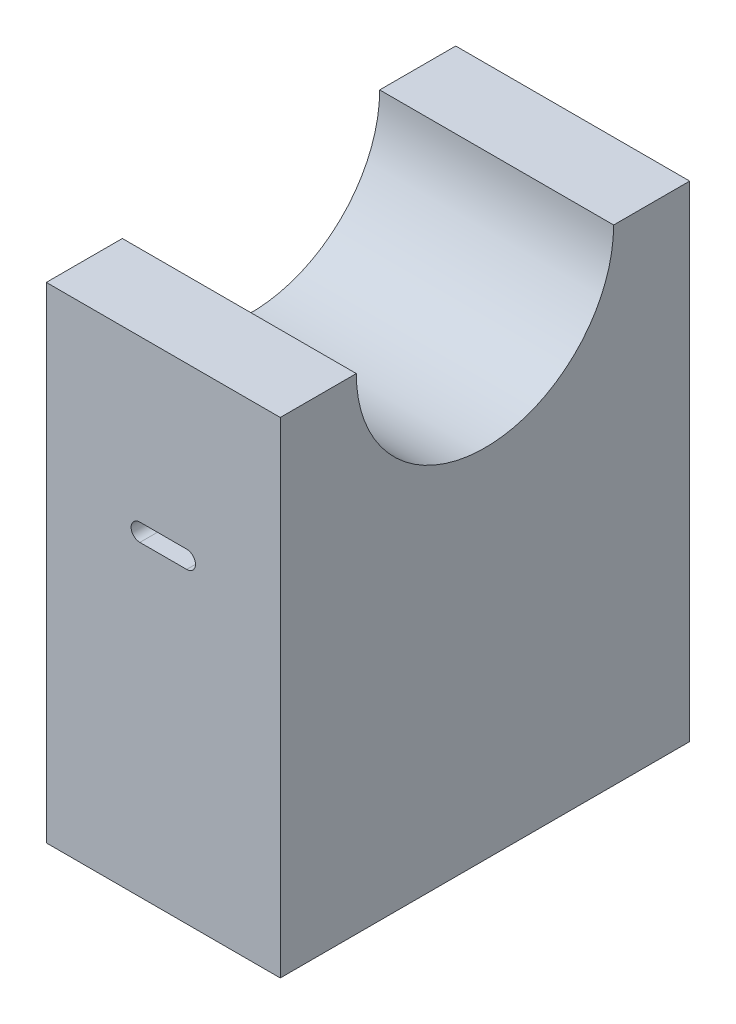
ISO-10303-21;
HEADER;
FILE_DESCRIPTION(('STEP AP214'),'2;1');
FILE_NAME('part.step','',(''),(''),'','','');
FILE_SCHEMA(('AUTOMOTIVE_DESIGN { 1 0 10303 214 1 1 1 1 }'));
ENDSEC;
DATA;
#1=APPLICATION_CONTEXT('core data for automotive mechanical design processes');
#2=APPLICATION_PROTOCOL_DEFINITION('international standard','automotive_design',2000,#1);
#3=PRODUCT_CONTEXT('',#1,'mechanical');
#4=PRODUCT('Part','Part','',(#3));
#5=PRODUCT_RELATED_PRODUCT_CATEGORY('part','',(#4));
#6=PRODUCT_DEFINITION_FORMATION('','',#4);
#7=PRODUCT_DEFINITION_CONTEXT('part definition',#1,'design');
#8=PRODUCT_DEFINITION('design','',#6,#7);
#9=PRODUCT_DEFINITION_SHAPE('','',#8);
#10=(LENGTH_UNIT() NAMED_UNIT(*) SI_UNIT(.MILLI.,.METRE.));
#11=(NAMED_UNIT(*) PLANE_ANGLE_UNIT() SI_UNIT($,.RADIAN.));
#12=(NAMED_UNIT(*) SI_UNIT($,.STERADIAN.) SOLID_ANGLE_UNIT());
#13=UNCERTAINTY_MEASURE_WITH_UNIT(LENGTH_MEASURE(1.E-05),#10,'distance_accuracy_value','');
#14=(GEOMETRIC_REPRESENTATION_CONTEXT(3) GLOBAL_UNCERTAINTY_ASSIGNED_CONTEXT((#13)) GLOBAL_UNIT_ASSIGNED_CONTEXT((#10,
#11,#12)) REPRESENTATION_CONTEXT('',''));
#15=CARTESIAN_POINT('',(0.,0.,0.));
#16=DIRECTION('',(0.,0.,1.));
#17=DIRECTION('',(1.,0.,0.));
#18=AXIS2_PLACEMENT_3D('',#15,#16,#17);
#19=CARTESIAN_POINT('',(0.,41.5,0.));
#20=DIRECTION('',(0.,1.,0.));
#21=DIRECTION('',(0.,0.,1.));
#22=AXIS2_PLACEMENT_3D('',#19,#20,#21);
#23=PLANE('',#22);
#24=DIRECTION('',(-1.,0.,0.));
#25=VECTOR('',#24,1.);
#26=CARTESIAN_POINT('',(10.,41.5,-11.));
#27=LINE('',#26,#25);
#28=CARTESIAN_POINT('',(10.,41.5,-11.));
#29=VERTEX_POINT('',#28);
#30=CARTESIAN_POINT('',(-10.,41.5,-11.));
#31=VERTEX_POINT('',#30);
#32=EDGE_CURVE('E11',#29,#31,#27,.T.);
#33=ORIENTED_EDGE('',*,*,#32,.F.);
#34=DIRECTION('',(0.,0.,-1.));
#35=VECTOR('',#34,1.);
#36=CARTESIAN_POINT('',(10.,41.5,-17.5));
#37=LINE('',#36,#35);
#38=CARTESIAN_POINT('',(10.,41.5,-17.5));
#39=VERTEX_POINT('',#38);
#40=EDGE_CURVE('E366',#29,#39,#37,.T.);
#41=ORIENTED_EDGE('',*,*,#40,.T.);
#42=DIRECTION('',(-1.,0.,0.));
#43=VECTOR('',#42,1.);
#44=CARTESIAN_POINT('',(-10.,41.5,-17.5));
#45=LINE('',#44,#43);
#46=CARTESIAN_POINT('',(-10.,41.5,-17.5));
#47=VERTEX_POINT('',#46);
#48=EDGE_CURVE('E365',#39,#47,#45,.T.);
#49=ORIENTED_EDGE('',*,*,#48,.T.);
#50=DIRECTION('',(0.,0.,1.));
#51=VECTOR('',#50,1.);
#52=CARTESIAN_POINT('',(-10.,41.5,-17.5));
#53=LINE('',#52,#51);
#54=EDGE_CURVE('E369',#47,#31,#53,.T.);
#55=ORIENTED_EDGE('',*,*,#54,.T.);
#56=EDGE_LOOP('',(#33,#41,#49,#55));
#57=FACE_BOUND('',#56,.T.);
#58=ADVANCED_FACE('F35',(#57),#23,.T.);
#59=CARTESIAN_POINT('',(10.,41.5,-17.5));
#60=DIRECTION('',(-1.,0.,0.));
#61=DIRECTION('',(0.,0.,1.));
#62=AXIS2_PLACEMENT_3D('',#59,#60,#61);
#63=PLANE('',#62);
#64=ORIENTED_EDGE('',*,*,#40,.F.);
#65=CARTESIAN_POINT('',(10.,41.5,0.));
#66=DIRECTION('',(-1.,0.,0.));
#67=DIRECTION('',(0.,0.,1.));
#68=AXIS2_PLACEMENT_3D('',#65,#66,#67);
#69=CIRCLE('',#68,11.);
#70=CARTESIAN_POINT('',(10.,41.5,11.));
#71=VERTEX_POINT('',#70);
#72=EDGE_CURVE('E357',#29,#71,#69,.T.);
#73=ORIENTED_EDGE('',*,*,#72,.T.);
#74=CARTESIAN_POINT('',(10.,41.5,17.5));
#75=VERTEX_POINT('',#74);
#76=EDGE_CURVE('E362',#75,#71,#37,.T.);
#77=ORIENTED_EDGE('',*,*,#76,.F.);
#78=DIRECTION('',(0.,-1.,0.));
#79=VECTOR('',#78,1.);
#80=CARTESIAN_POINT('',(10.,41.5,17.5));
#81=LINE('',#80,#79);
#82=CARTESIAN_POINT('',(10.,0.,17.5));
#83=VERTEX_POINT('',#82);
#84=EDGE_CURVE('E374',#75,#83,#81,.T.);
#85=ORIENTED_EDGE('',*,*,#84,.T.);
#86=DIRECTION('',(0.,0.,-1.));
#87=VECTOR('',#86,1.);
#88=CARTESIAN_POINT('',(10.,0.,-17.5));
#89=LINE('',#88,#87);
#90=CARTESIAN_POINT('',(10.,0.,-17.5));
#91=VERTEX_POINT('',#90);
#92=EDGE_CURVE('E360',#83,#91,#89,.T.);
#93=ORIENTED_EDGE('',*,*,#92,.T.);
#94=DIRECTION('',(0.,-1.,0.));
#95=VECTOR('',#94,1.);
#96=CARTESIAN_POINT('',(10.,41.5,-17.5));
#97=LINE('',#96,#95);
#98=EDGE_CURVE('E391',#39,#91,#97,.T.);
#99=ORIENTED_EDGE('',*,*,#98,.F.);
#100=EDGE_LOOP('',(#64,#73,#77,#85,#93,#99));
#101=FACE_BOUND('',#100,.T.);
#102=ADVANCED_FACE('F37',(#101),#63,.F.);
#103=CARTESIAN_POINT('',(-10.,41.5,-17.5));
#104=DIRECTION('',(0.,0.,1.));
#105=DIRECTION('',(1.,0.,0.));
#106=AXIS2_PLACEMENT_3D('',#103,#104,#105);
#107=PLANE('',#106);
#108=DIRECTION('',(-1.,0.,0.));
#109=VECTOR('',#108,1.);
#110=CARTESIAN_POINT('',(-2.,27.75,-17.5));
#111=LINE('',#110,#109);
#112=CARTESIAN_POINT('',(2.,27.75,-17.5));
#113=VERTEX_POINT('',#112);
#114=CARTESIAN_POINT('',(-2.,27.75,-17.5));
#115=VERTEX_POINT('',#114);
#116=EDGE_CURVE('E335',#113,#115,#111,.T.);
#117=ORIENTED_EDGE('',*,*,#116,.T.);
#118=CARTESIAN_POINT('',(-2.,27.,-17.5));
#119=DIRECTION('',(0.,0.,1.));
#120=DIRECTION('',(1.,0.,0.));
#121=AXIS2_PLACEMENT_3D('',#118,#119,#120);
#122=CIRCLE('',#121,0.750000000000001);
#123=CARTESIAN_POINT('',(-2.,26.25,-17.5));
#124=VERTEX_POINT('',#123);
#125=EDGE_CURVE('E327',#115,#124,#122,.T.);
#126=ORIENTED_EDGE('',*,*,#125,.T.);
#127=DIRECTION('',(1.,0.,0.));
#128=VECTOR('',#127,1.);
#129=CARTESIAN_POINT('',(-2.,26.25,-17.5));
#130=LINE('',#129,#128);
#131=CARTESIAN_POINT('',(2.,26.25,-17.5));
#132=VERTEX_POINT('',#131);
#133=EDGE_CURVE('E330',#124,#132,#130,.T.);
#134=ORIENTED_EDGE('',*,*,#133,.T.);
#135=CARTESIAN_POINT('',(2.,27.,-17.5));
#136=DIRECTION('',(0.,0.,1.));
#137=DIRECTION('',(1.,0.,0.));
#138=AXIS2_PLACEMENT_3D('',#135,#136,#137);
#139=CIRCLE('',#138,0.750000000000001);
#140=EDGE_CURVE('E58',#132,#113,#139,.T.);
#141=ORIENTED_EDGE('',*,*,#140,.T.);
#142=EDGE_LOOP('',(#117,#126,#134,#141));
#143=FACE_BOUND('',#142,.T.);
#144=DIRECTION('',(-1.,0.,0.));
#145=VECTOR('',#144,1.);
#146=CARTESIAN_POINT('',(-10.,0.,-17.5));
#147=LINE('',#146,#145);
#148=CARTESIAN_POINT('',(-10.,0.,-17.5));
#149=VERTEX_POINT('',#148);
#150=EDGE_CURVE('E377',#91,#149,#147,.T.);
#151=ORIENTED_EDGE('',*,*,#150,.T.);
#152=DIRECTION('',(0.,-1.,0.));
#153=VECTOR('',#152,1.);
#154=CARTESIAN_POINT('',(-10.,41.5,-17.5));
#155=LINE('',#154,#153);
#156=EDGE_CURVE('E388',#47,#149,#155,.T.);
#157=ORIENTED_EDGE('',*,*,#156,.F.);
#158=ORIENTED_EDGE('',*,*,#48,.F.);
#159=ORIENTED_EDGE('',*,*,#98,.T.);
#160=EDGE_LOOP('',(#151,#157,#158,#159));
#161=FACE_BOUND('',#160,.T.);
#162=ADVANCED_FACE('F418',(#143,#161),#107,.F.);
#163=CARTESIAN_POINT('',(-10.,41.5,-17.5));
#164=DIRECTION('',(1.,0.,0.));
#165=DIRECTION('',(0.,0.,-1.));
#166=AXIS2_PLACEMENT_3D('',#163,#164,#165);
#167=PLANE('',#166);
#168=CARTESIAN_POINT('',(-10.,41.5,11.));
#169=VERTEX_POINT('',#168);
#170=CARTESIAN_POINT('',(-9.99999999999999,41.5,17.5));
#171=VERTEX_POINT('',#170);
#172=EDGE_CURVE('E368',#169,#171,#53,.T.);
#173=ORIENTED_EDGE('',*,*,#172,.F.);
#174=CARTESIAN_POINT('',(-10.,41.5,0.));
#175=DIRECTION('',(-1.,0.,0.));
#176=DIRECTION('',(0.,0.,1.));
#177=AXIS2_PLACEMENT_3D('',#174,#175,#176);
#178=CIRCLE('',#177,11.);
#179=EDGE_CURVE('E350',#31,#169,#178,.T.);
#180=ORIENTED_EDGE('',*,*,#179,.F.);
#181=ORIENTED_EDGE('',*,*,#54,.F.);
#182=ORIENTED_EDGE('',*,*,#156,.T.);
#183=DIRECTION('',(0.,0.,1.));
#184=VECTOR('',#183,1.);
#185=CARTESIAN_POINT('',(-10.,0.,-17.5));
#186=LINE('',#185,#184);
#187=CARTESIAN_POINT('',(-9.99999999999999,0.,17.5));
#188=VERTEX_POINT('',#187);
#189=EDGE_CURVE('E379',#149,#188,#186,.T.);
#190=ORIENTED_EDGE('',*,*,#189,.T.);
#191=DIRECTION('',(0.,-1.,0.));
#192=VECTOR('',#191,1.);
#193=CARTESIAN_POINT('',(-9.99999999999999,41.5,17.5));
#194=LINE('',#193,#192);
#195=EDGE_CURVE('E385',#171,#188,#194,.T.);
#196=ORIENTED_EDGE('',*,*,#195,.F.);
#197=EDGE_LOOP('',(#173,#180,#181,#182,#190,#196));
#198=FACE_BOUND('',#197,.T.);
#199=ADVANCED_FACE('F422',(#198),#167,.F.);
#200=CARTESIAN_POINT('',(-9.99999999999999,41.5,17.5));
#201=DIRECTION('',(0.,0.,-1.));
#202=DIRECTION('',(-1.,0.,0.));
#203=AXIS2_PLACEMENT_3D('',#200,#201,#202);
#204=PLANE('',#203);
#205=DIRECTION('',(1.,0.,0.));
#206=VECTOR('',#205,1.);
#207=CARTESIAN_POINT('',(-2.,26.25,17.5));
#208=LINE('',#207,#206);
#209=CARTESIAN_POINT('',(-2.,26.25,17.5));
#210=VERTEX_POINT('',#209);
#211=CARTESIAN_POINT('',(2.,26.25,17.5));
#212=VERTEX_POINT('',#211);
#213=EDGE_CURVE('E340',#210,#212,#208,.T.);
#214=ORIENTED_EDGE('',*,*,#213,.F.);
#215=CARTESIAN_POINT('',(-2.,27.,17.5));
#216=DIRECTION('',(0.,0.,1.));
#217=DIRECTION('',(1.,0.,0.));
#218=AXIS2_PLACEMENT_3D('',#215,#216,#217);
#219=CIRCLE('',#218,0.750000000000001);
#220=CARTESIAN_POINT('',(-2.,27.75,17.5));
#221=VERTEX_POINT('',#220);
#222=EDGE_CURVE('E324',#221,#210,#219,.T.);
#223=ORIENTED_EDGE('',*,*,#222,.F.);
#224=DIRECTION('',(-1.,0.,0.));
#225=VECTOR('',#224,1.);
#226=CARTESIAN_POINT('',(-2.,27.75,17.5));
#227=LINE('',#226,#225);
#228=CARTESIAN_POINT('',(2.,27.75,17.5));
#229=VERTEX_POINT('',#228);
#230=EDGE_CURVE('E331',#229,#221,#227,.T.);
#231=ORIENTED_EDGE('',*,*,#230,.F.);
#232=CARTESIAN_POINT('',(2.,27.,17.5));
#233=DIRECTION('',(0.,0.,1.));
#234=DIRECTION('',(1.,0.,0.));
#235=AXIS2_PLACEMENT_3D('',#232,#233,#234);
#236=CIRCLE('',#235,0.750000000000001);
#237=EDGE_CURVE('E343',#212,#229,#236,.T.);
#238=ORIENTED_EDGE('',*,*,#237,.F.);
#239=EDGE_LOOP('',(#214,#223,#231,#238));
#240=FACE_BOUND('',#239,.T.);
#241=DIRECTION('',(1.,0.,0.));
#242=VECTOR('',#241,1.);
#243=CARTESIAN_POINT('',(-9.99999999999999,0.,17.5));
#244=LINE('',#243,#242);
#245=EDGE_CURVE('E381',#188,#83,#244,.T.);
#246=ORIENTED_EDGE('',*,*,#245,.T.);
#247=ORIENTED_EDGE('',*,*,#84,.F.);
#248=DIRECTION('',(1.,0.,0.));
#249=VECTOR('',#248,1.);
#250=CARTESIAN_POINT('',(-9.99999999999999,41.5,17.5));
#251=LINE('',#250,#249);
#252=EDGE_CURVE('E372',#171,#75,#251,.T.);
#253=ORIENTED_EDGE('',*,*,#252,.F.);
#254=ORIENTED_EDGE('',*,*,#195,.T.);
#255=EDGE_LOOP('',(#246,#247,#253,#254));
#256=FACE_BOUND('',#255,.T.);
#257=ADVANCED_FACE('F409',(#240,#256),#204,.F.);
#258=DIRECTION('',(-1.,0.,0.));
#259=VECTOR('',#258,1.);
#260=CARTESIAN_POINT('',(10.,41.5,11.));
#261=LINE('',#260,#259);
#262=EDGE_CURVE('E43',#169,#71,#261,.F.);
#263=ORIENTED_EDGE('',*,*,#262,.F.);
#264=ORIENTED_EDGE('',*,*,#172,.T.);
#265=ORIENTED_EDGE('',*,*,#252,.T.);
#266=ORIENTED_EDGE('',*,*,#76,.T.);
#267=EDGE_LOOP('',(#263,#264,#265,#266));
#268=FACE_BOUND('',#267,.T.);
#269=ADVANCED_FACE('F404',(#268),#23,.T.);
#270=CARTESIAN_POINT('',(0.,0.,0.));
#271=DIRECTION('',(0.,1.,0.));
#272=DIRECTION('',(0.,0.,1.));
#273=AXIS2_PLACEMENT_3D('',#270,#271,#272);
#274=PLANE('',#273);
#275=CARTESIAN_POINT('',(0.,0.,15.));
#276=DIRECTION('',(0.,1.,0.));
#277=DIRECTION('',(0.,0.,1.));
#278=AXIS2_PLACEMENT_3D('',#275,#276,#277);
#279=CIRCLE('',#278,3.25);
#280=CARTESIAN_POINT('',(-3.21130814466628,0.,15.5));
#281=VERTEX_POINT('',#280);
#282=CARTESIAN_POINT('',(3.21130814466628,0.,15.5));
#283=VERTEX_POINT('',#282);
#284=EDGE_CURVE('E291',#281,#283,#279,.F.);
#285=ORIENTED_EDGE('',*,*,#284,.T.);
#286=DIRECTION('',(1.,0.,0.));
#287=VECTOR('',#286,1.);
#288=CARTESIAN_POINT('',(-9.99999999999999,0.,15.5));
#289=LINE('',#288,#287);
#290=CARTESIAN_POINT('',(8.00000000000001,0.,15.5));
#291=VERTEX_POINT('',#290);
#292=EDGE_CURVE('E278',#283,#291,#289,.T.);
#293=ORIENTED_EDGE('',*,*,#292,.T.);
#294=DIRECTION('',(0.,0.,-1.));
#295=VECTOR('',#294,1.);
#296=CARTESIAN_POINT('',(8.,0.,-17.5));
#297=LINE('',#296,#295);
#298=CARTESIAN_POINT('',(8.,0.,-15.5));
#299=VERTEX_POINT('',#298);
#300=EDGE_CURVE('E232',#291,#299,#297,.T.);
#301=ORIENTED_EDGE('',*,*,#300,.T.);
#302=DIRECTION('',(-1.,0.,0.));
#303=VECTOR('',#302,1.);
#304=CARTESIAN_POINT('',(-10.,0.,-15.5));
#305=LINE('',#304,#303);
#306=CARTESIAN_POINT('',(3.21130814466628,0.,-15.5));
#307=VERTEX_POINT('',#306);
#308=EDGE_CURVE('E277',#299,#307,#305,.T.);
#309=ORIENTED_EDGE('',*,*,#308,.T.);
#310=CARTESIAN_POINT('',(0.,0.,-15.));
#311=DIRECTION('',(0.,1.,0.));
#312=DIRECTION('',(0.,0.,1.));
#313=AXIS2_PLACEMENT_3D('',#310,#311,#312);
#314=CIRCLE('',#313,3.25);
#315=CARTESIAN_POINT('',(-3.21130814466628,0.,-15.5));
#316=VERTEX_POINT('',#315);
#317=EDGE_CURVE('E292',#307,#316,#314,.F.);
#318=ORIENTED_EDGE('',*,*,#317,.T.);
#319=CARTESIAN_POINT('',(-8.,0.,-15.5));
#320=VERTEX_POINT('',#319);
#321=EDGE_CURVE('E285',#316,#320,#305,.T.);
#322=ORIENTED_EDGE('',*,*,#321,.T.);
#323=DIRECTION('',(0.,0.,1.));
#324=VECTOR('',#323,1.);
#325=CARTESIAN_POINT('',(-8.,0.,-17.5));
#326=LINE('',#325,#324);
#327=CARTESIAN_POINT('',(-7.99999999999999,0.,15.5));
#328=VERTEX_POINT('',#327);
#329=EDGE_CURVE('E282',#320,#328,#326,.T.);
#330=ORIENTED_EDGE('',*,*,#329,.T.);
#331=EDGE_CURVE('E281',#328,#281,#289,.T.);
#332=ORIENTED_EDGE('',*,*,#331,.T.);
#333=EDGE_LOOP('',(#285,#293,#301,#309,#318,#322,#330,#332));
#334=FACE_BOUND('',#333,.T.);
#335=CARTESIAN_POINT('',(0.,0.,-15.));
#336=DIRECTION('',(0.,-1.,0.));
#337=DIRECTION('',(0.,0.,-1.));
#338=AXIS2_PLACEMENT_3D('',#335,#336,#337);
#339=CIRCLE('',#338,1.25);
#340=CARTESIAN_POINT('',(0.,0.,-16.25));
#341=VERTEX_POINT('',#340);
#342=EDGE_CURVE('E314',#341,#341,#339,.T.);
#343=ORIENTED_EDGE('',*,*,#342,.F.);
#344=EDGE_LOOP('',(#343));
#345=FACE_BOUND('',#344,.T.);
#346=CARTESIAN_POINT('',(0.,0.,15.));
#347=DIRECTION('',(0.,-1.,0.));
#348=DIRECTION('',(0.,0.,-1.));
#349=AXIS2_PLACEMENT_3D('',#346,#347,#348);
#350=CIRCLE('',#349,1.25);
#351=CARTESIAN_POINT('',(0.,0.,13.75));
#352=VERTEX_POINT('',#351);
#353=EDGE_CURVE('E318',#352,#352,#350,.T.);
#354=ORIENTED_EDGE('',*,*,#353,.F.);
#355=EDGE_LOOP('',(#354));
#356=FACE_BOUND('',#355,.T.);
#357=ORIENTED_EDGE('',*,*,#92,.F.);
#358=ORIENTED_EDGE('',*,*,#245,.F.);
#359=ORIENTED_EDGE('',*,*,#189,.F.);
#360=ORIENTED_EDGE('',*,*,#150,.F.);
#361=EDGE_LOOP('',(#357,#358,#359,#360));
#362=FACE_BOUND('',#361,.T.);
#363=ADVANCED_FACE('F413',(#334,#345,#356,#362),#274,.F.);
#364=CARTESIAN_POINT('',(10.,41.5,0.));
#365=DIRECTION('',(-1.,0.,0.));
#366=DIRECTION('',(0.,0.,1.));
#367=AXIS2_PLACEMENT_3D('',#364,#365,#366);
#368=CYLINDRICAL_SURFACE('',#367,11.);
#369=ORIENTED_EDGE('',*,*,#32,.T.);
#370=ORIENTED_EDGE('',*,*,#179,.T.);
#371=ORIENTED_EDGE('',*,*,#262,.T.);
#372=ORIENTED_EDGE('',*,*,#72,.F.);
#373=EDGE_LOOP('',(#369,#370,#371,#372));
#374=FACE_BOUND('',#373,.T.);
#375=ADVANCED_FACE('F395',(#374),#368,.F.);
#376=CARTESIAN_POINT('',(-2.,27.,-17.5));
#377=DIRECTION('',(0.,0.,1.));
#378=DIRECTION('',(1.,0.,0.));
#379=AXIS2_PLACEMENT_3D('',#376,#377,#378);
#380=CYLINDRICAL_SURFACE('',#379,0.750000000000001);
#381=ORIENTED_EDGE('',*,*,#222,.T.);
#382=DIRECTION('',(0.,0.,1.));
#383=VECTOR('',#382,1.);
#384=CARTESIAN_POINT('',(-2.,26.25,-17.5));
#385=LINE('',#384,#383);
#386=EDGE_CURVE('E338',#124,#210,#385,.T.);
#387=ORIENTED_EDGE('',*,*,#386,.F.);
#388=ORIENTED_EDGE('',*,*,#125,.F.);
#389=DIRECTION('',(0.,0.,1.));
#390=VECTOR('',#389,1.);
#391=CARTESIAN_POINT('',(-2.,27.75,-17.5));
#392=LINE('',#391,#390);
#393=EDGE_CURVE('E348',#115,#221,#392,.T.);
#394=ORIENTED_EDGE('',*,*,#393,.T.);
#395=EDGE_LOOP('',(#381,#387,#388,#394));
#396=FACE_BOUND('',#395,.T.);
#397=ADVANCED_FACE('F447',(#396),#380,.F.);
#398=CARTESIAN_POINT('',(-2.,27.75,-17.5));
#399=DIRECTION('',(0.,1.,0.));
#400=DIRECTION('',(0.,0.,1.));
#401=AXIS2_PLACEMENT_3D('',#398,#399,#400);
#402=PLANE('',#401);
#403=ORIENTED_EDGE('',*,*,#230,.T.);
#404=ORIENTED_EDGE('',*,*,#393,.F.);
#405=ORIENTED_EDGE('',*,*,#116,.F.);
#406=DIRECTION('',(0.,0.,1.));
#407=VECTOR('',#406,1.);
#408=CARTESIAN_POINT('',(2.,27.75,-17.5));
#409=LINE('',#408,#407);
#410=EDGE_CURVE('E351',#113,#229,#409,.T.);
#411=ORIENTED_EDGE('',*,*,#410,.T.);
#412=EDGE_LOOP('',(#403,#404,#405,#411));
#413=FACE_BOUND('',#412,.T.);
#414=ADVANCED_FACE('F474',(#413),#402,.F.);
#415=CARTESIAN_POINT('',(2.,27.,-17.5));
#416=DIRECTION('',(0.,0.,1.));
#417=DIRECTION('',(1.,0.,0.));
#418=AXIS2_PLACEMENT_3D('',#415,#416,#417);
#419=CYLINDRICAL_SURFACE('',#418,0.750000000000001);
#420=ORIENTED_EDGE('',*,*,#237,.T.);
#421=ORIENTED_EDGE('',*,*,#410,.F.);
#422=ORIENTED_EDGE('',*,*,#140,.F.);
#423=DIRECTION('',(0.,0.,1.));
#424=VECTOR('',#423,1.);
#425=CARTESIAN_POINT('',(2.,26.25,-17.5));
#426=LINE('',#425,#424);
#427=EDGE_CURVE('E353',#132,#212,#426,.T.);
#428=ORIENTED_EDGE('',*,*,#427,.T.);
#429=EDGE_LOOP('',(#420,#421,#422,#428));
#430=FACE_BOUND('',#429,.T.);
#431=ADVANCED_FACE('F468',(#430),#419,.F.);
#432=CARTESIAN_POINT('',(-2.,26.25,-17.5));
#433=DIRECTION('',(0.,-1.,0.));
#434=DIRECTION('',(0.,0.,-1.));
#435=AXIS2_PLACEMENT_3D('',#432,#433,#434);
#436=PLANE('',#435);
#437=ORIENTED_EDGE('',*,*,#213,.T.);
#438=ORIENTED_EDGE('',*,*,#427,.F.);
#439=ORIENTED_EDGE('',*,*,#133,.F.);
#440=ORIENTED_EDGE('',*,*,#386,.T.);
#441=EDGE_LOOP('',(#437,#438,#439,#440));
#442=FACE_BOUND('',#441,.T.);
#443=ADVANCED_FACE('F458',(#442),#436,.F.);
#444=CARTESIAN_POINT('',(0.,10.,15.));
#445=DIRECTION('',(0.,-1.,0.));
#446=DIRECTION('',(0.,0.,-1.));
#447=AXIS2_PLACEMENT_3D('',#444,#445,#446);
#448=CYLINDRICAL_SURFACE('',#447,1.25);
#449=CARTESIAN_POINT('',(0.,10.,15.));
#450=DIRECTION('',(0.,-1.,0.));
#451=DIRECTION('',(0.,0.,-1.));
#452=AXIS2_PLACEMENT_3D('',#449,#450,#451);
#453=CIRCLE('',#452,1.25);
#454=CARTESIAN_POINT('',(0.,10.,13.75));
#455=VERTEX_POINT('',#454);
#456=EDGE_CURVE('E321',#455,#455,#453,.T.);
#457=ORIENTED_EDGE('',*,*,#456,.F.);
#458=EDGE_LOOP('',(#457));
#459=FACE_BOUND('',#458,.T.);
#460=ORIENTED_EDGE('',*,*,#353,.T.);
#461=EDGE_LOOP('',(#460));
#462=FACE_BOUND('',#461,.T.);
#463=ADVANCED_FACE('F455',(#459,#462),#448,.F.);
#464=CARTESIAN_POINT('',(0.,10.,15.));
#465=DIRECTION('',(0.,-1.,0.));
#466=DIRECTION('',(0.,0.,-1.));
#467=AXIS2_PLACEMENT_3D('',#464,#465,#466);
#468=PLANE('',#467);
#469=ORIENTED_EDGE('',*,*,#456,.T.);
#470=EDGE_LOOP('',(#469));
#471=FACE_BOUND('',#470,.T.);
#472=ADVANCED_FACE('F457',(#471),#468,.T.);
#473=CARTESIAN_POINT('',(0.,10.,-15.));
#474=DIRECTION('',(0.,-1.,0.));
#475=DIRECTION('',(0.,0.,-1.));
#476=AXIS2_PLACEMENT_3D('',#473,#474,#475);
#477=CYLINDRICAL_SURFACE('',#476,1.25);
#478=CARTESIAN_POINT('',(0.,10.,-15.));
#479=DIRECTION('',(0.,-1.,0.));
#480=DIRECTION('',(0.,0.,-1.));
#481=AXIS2_PLACEMENT_3D('',#478,#479,#480);
#482=CIRCLE('',#481,1.25);
#483=CARTESIAN_POINT('',(0.,10.,-16.25));
#484=VERTEX_POINT('',#483);
#485=EDGE_CURVE('E315',#484,#484,#482,.T.);
#486=ORIENTED_EDGE('',*,*,#485,.F.);
#487=EDGE_LOOP('',(#486));
#488=FACE_BOUND('',#487,.T.);
#489=ORIENTED_EDGE('',*,*,#342,.T.);
#490=EDGE_LOOP('',(#489));
#491=FACE_BOUND('',#490,.T.);
#492=ADVANCED_FACE('F465',(#488,#491),#477,.F.);
#493=CARTESIAN_POINT('',(0.,10.,-15.));
#494=DIRECTION('',(0.,-1.,0.));
#495=DIRECTION('',(0.,0.,-1.));
#496=AXIS2_PLACEMENT_3D('',#493,#494,#495);
#497=PLANE('',#496);
#498=ORIENTED_EDGE('',*,*,#485,.T.);
#499=EDGE_LOOP('',(#498));
#500=FACE_BOUND('',#499,.T.);
#501=ADVANCED_FACE('F525',(#500),#497,.T.);
#502=CARTESIAN_POINT('',(-10.,41.5,-15.5));
#503=DIRECTION('',(0.,0.,1.));
#504=DIRECTION('',(1.,0.,0.));
#505=AXIS2_PLACEMENT_3D('',#502,#503,#504);
#506=PLANE('',#505);
#507=DIRECTION('',(-1.,0.,0.));
#508=VECTOR('',#507,1.);
#509=CARTESIAN_POINT('',(-10.,29.75,-15.5));
#510=LINE('',#509,#508);
#511=CARTESIAN_POINT('',(2.,29.75,-15.5));
#512=VERTEX_POINT('',#511);
#513=CARTESIAN_POINT('',(-2.,29.75,-15.5));
#514=VERTEX_POINT('',#513);
#515=EDGE_CURVE('E239',#512,#514,#510,.T.);
#516=ORIENTED_EDGE('',*,*,#515,.F.);
#517=CARTESIAN_POINT('',(2.,27.,-15.5));
#518=DIRECTION('',(0.,0.,1.));
#519=DIRECTION('',(1.,0.,0.));
#520=AXIS2_PLACEMENT_3D('',#517,#518,#519);
#521=CIRCLE('',#520,2.75);
#522=CARTESIAN_POINT('',(2.,24.25,-15.5));
#523=VERTEX_POINT('',#522);
#524=EDGE_CURVE('E243',#523,#512,#521,.T.);
#525=ORIENTED_EDGE('',*,*,#524,.F.);
#526=DIRECTION('',(1.,0.,0.));
#527=VECTOR('',#526,1.);
#528=CARTESIAN_POINT('',(-10.,24.25,-15.5));
#529=LINE('',#528,#527);
#530=CARTESIAN_POINT('',(-2.,24.25,-15.5));
#531=VERTEX_POINT('',#530);
#532=EDGE_CURVE('E247',#531,#523,#529,.T.);
#533=ORIENTED_EDGE('',*,*,#532,.F.);
#534=CARTESIAN_POINT('',(-2.,27.,-15.5));
#535=DIRECTION('',(0.,0.,1.));
#536=DIRECTION('',(1.,0.,0.));
#537=AXIS2_PLACEMENT_3D('',#534,#535,#536);
#538=CIRCLE('',#537,2.75);
#539=EDGE_CURVE('E244',#514,#531,#538,.T.);
#540=ORIENTED_EDGE('',*,*,#539,.F.);
#541=EDGE_LOOP('',(#516,#525,#533,#540));
#542=FACE_BOUND('',#541,.T.);
#543=DIRECTION('',(1.,0.,0.));
#544=VECTOR('',#543,1.);
#545=CARTESIAN_POINT('',(-10.,12.,-15.5));
#546=LINE('',#545,#544);
#547=CARTESIAN_POINT('',(-3.21130814466628,12.,-15.5));
#548=VERTEX_POINT('',#547);
#549=CARTESIAN_POINT('',(3.21130814466628,12.,-15.5));
#550=VERTEX_POINT('',#549);
#551=EDGE_CURVE('E311',#548,#550,#546,.T.);
#552=ORIENTED_EDGE('',*,*,#551,.T.);
#553=DIRECTION('',(0.,-1.,0.));
#554=VECTOR('',#553,1.);
#555=CARTESIAN_POINT('',(3.21130814466628,10.,-15.5));
#556=LINE('',#555,#554);
#557=EDGE_CURVE('E306',#307,#550,#556,.F.);
#558=ORIENTED_EDGE('',*,*,#557,.F.);
#559=ORIENTED_EDGE('',*,*,#308,.F.);
#560=DIRECTION('',(0.,-1.,0.));
#561=VECTOR('',#560,1.);
#562=CARTESIAN_POINT('',(8.,41.5,-15.5));
#563=LINE('',#562,#561);
#564=CARTESIAN_POINT('',(8.,39.5,-15.5));
#565=VERTEX_POINT('',#564);
#566=EDGE_CURVE('E50',#565,#299,#563,.T.);
#567=ORIENTED_EDGE('',*,*,#566,.F.);
#568=DIRECTION('',(-1.,0.,0.));
#569=VECTOR('',#568,1.);
#570=CARTESIAN_POINT('',(-10.,39.5,-15.5));
#571=LINE('',#570,#569);
#572=CARTESIAN_POINT('',(-8.,39.5,-15.5));
#573=VERTEX_POINT('',#572);
#574=EDGE_CURVE('E226',#565,#573,#571,.T.);
#575=ORIENTED_EDGE('',*,*,#574,.T.);
#576=DIRECTION('',(0.,-1.,0.));
#577=VECTOR('',#576,1.);
#578=CARTESIAN_POINT('',(-8.,41.5,-15.5));
#579=LINE('',#578,#577);
#580=EDGE_CURVE('E220',#573,#320,#579,.T.);
#581=ORIENTED_EDGE('',*,*,#580,.T.);
#582=ORIENTED_EDGE('',*,*,#321,.F.);
#583=DIRECTION('',(0.,-1.,0.));
#584=VECTOR('',#583,1.);
#585=CARTESIAN_POINT('',(-3.21130814466628,10.,-15.5));
#586=LINE('',#585,#584);
#587=EDGE_CURVE('E303',#316,#548,#586,.F.);
#588=ORIENTED_EDGE('',*,*,#587,.T.);
#589=EDGE_LOOP('',(#552,#558,#559,#567,#575,#581,#582,#588));
#590=FACE_BOUND('',#589,.T.);
#591=ADVANCED_FACE('F533',(#542,#590),#506,.T.);
#592=CARTESIAN_POINT('',(-9.99999999999999,41.5,15.5));
#593=DIRECTION('',(0.,0.,-1.));
#594=DIRECTION('',(-1.,0.,0.));
#595=AXIS2_PLACEMENT_3D('',#592,#593,#594);
#596=PLANE('',#595);
#597=DIRECTION('',(1.,0.,0.));
#598=VECTOR('',#597,1.);
#599=CARTESIAN_POINT('',(-2.,24.25,15.5));
#600=LINE('',#599,#598);
#601=CARTESIAN_POINT('',(-2.,24.25,15.5));
#602=VERTEX_POINT('',#601);
#603=CARTESIAN_POINT('',(2.,24.25,15.5));
#604=VERTEX_POINT('',#603);
#605=EDGE_CURVE('E256',#602,#604,#600,.T.);
#606=ORIENTED_EDGE('',*,*,#605,.T.);
#607=CARTESIAN_POINT('',(2.,27.,15.5));
#608=DIRECTION('',(0.,0.,-1.));
#609=DIRECTION('',(-1.,0.,0.));
#610=AXIS2_PLACEMENT_3D('',#607,#608,#609);
#611=CIRCLE('',#610,2.75);
#612=CARTESIAN_POINT('',(2.,29.75,15.5));
#613=VERTEX_POINT('',#612);
#614=EDGE_CURVE('E259',#604,#613,#611,.F.);
#615=ORIENTED_EDGE('',*,*,#614,.T.);
#616=DIRECTION('',(-1.,0.,0.));
#617=VECTOR('',#616,1.);
#618=CARTESIAN_POINT('',(-2.,29.75,15.5));
#619=LINE('',#618,#617);
#620=CARTESIAN_POINT('',(-2.,29.75,15.5));
#621=VERTEX_POINT('',#620);
#622=EDGE_CURVE('E248',#613,#621,#619,.T.);
#623=ORIENTED_EDGE('',*,*,#622,.T.);
#624=CARTESIAN_POINT('',(-2.,27.,15.5));
#625=DIRECTION('',(0.,0.,-1.));
#626=DIRECTION('',(-1.,0.,0.));
#627=AXIS2_PLACEMENT_3D('',#624,#625,#626);
#628=CIRCLE('',#627,2.75);
#629=EDGE_CURVE('E260',#621,#602,#628,.F.);
#630=ORIENTED_EDGE('',*,*,#629,.T.);
#631=EDGE_LOOP('',(#606,#615,#623,#630));
#632=FACE_BOUND('',#631,.T.);
#633=DIRECTION('',(-1.,0.,0.));
#634=VECTOR('',#633,1.);
#635=CARTESIAN_POINT('',(-9.99999999999999,12.,15.5));
#636=LINE('',#635,#634);
#637=CARTESIAN_POINT('',(3.21130814466628,12.,15.5));
#638=VERTEX_POINT('',#637);
#639=CARTESIAN_POINT('',(-3.21130814466628,12.,15.5));
#640=VERTEX_POINT('',#639);
#641=EDGE_CURVE('E308',#638,#640,#636,.T.);
#642=ORIENTED_EDGE('',*,*,#641,.T.);
#643=DIRECTION('',(0.,-1.,0.));
#644=VECTOR('',#643,1.);
#645=CARTESIAN_POINT('',(-3.21130814466628,10.,15.5));
#646=LINE('',#645,#644);
#647=EDGE_CURVE('E301',#281,#640,#646,.F.);
#648=ORIENTED_EDGE('',*,*,#647,.F.);
#649=ORIENTED_EDGE('',*,*,#331,.F.);
#650=DIRECTION('',(0.,-1.,0.));
#651=VECTOR('',#650,1.);
#652=CARTESIAN_POINT('',(-7.99999999999999,41.5,15.5));
#653=LINE('',#652,#651);
#654=CARTESIAN_POINT('',(-7.99999999999999,39.5,15.5));
#655=VERTEX_POINT('',#654);
#656=EDGE_CURVE('E237',#655,#328,#653,.T.);
#657=ORIENTED_EDGE('',*,*,#656,.F.);
#658=DIRECTION('',(1.,0.,0.));
#659=VECTOR('',#658,1.);
#660=CARTESIAN_POINT('',(-9.99999999999999,39.5,15.5));
#661=LINE('',#660,#659);
#662=CARTESIAN_POINT('',(8.00000000000001,39.5,15.5));
#663=VERTEX_POINT('',#662);
#664=EDGE_CURVE('E221',#655,#663,#661,.T.);
#665=ORIENTED_EDGE('',*,*,#664,.T.);
#666=DIRECTION('',(0.,-1.,0.));
#667=VECTOR('',#666,1.);
#668=CARTESIAN_POINT('',(8.00000000000001,41.5,15.5));
#669=LINE('',#668,#667);
#670=EDGE_CURVE('E224',#663,#291,#669,.T.);
#671=ORIENTED_EDGE('',*,*,#670,.T.);
#672=ORIENTED_EDGE('',*,*,#292,.F.);
#673=DIRECTION('',(0.,-1.,0.));
#674=VECTOR('',#673,1.);
#675=CARTESIAN_POINT('',(3.21130814466628,10.,15.5));
#676=LINE('',#675,#674);
#677=EDGE_CURVE('E206',#283,#638,#676,.F.);
#678=ORIENTED_EDGE('',*,*,#677,.T.);
#679=EDGE_LOOP('',(#642,#648,#649,#657,#665,#671,#672,#678));
#680=FACE_BOUND('',#679,.T.);
#681=ADVANCED_FACE('F551',(#632,#680),#596,.T.);
#682=CARTESIAN_POINT('',(0.,39.5,0.));
#683=DIRECTION('',(0.,1.,0.));
#684=DIRECTION('',(0.,0.,1.));
#685=AXIS2_PLACEMENT_3D('',#682,#683,#684);
#686=PLANE('',#685);
#687=DIRECTION('',(-1.,0.,0.));
#688=VECTOR('',#687,1.);
#689=CARTESIAN_POINT('',(8.,39.5,-12.8452325786651));
#690=LINE('',#689,#688);
#691=CARTESIAN_POINT('',(8.,39.5,-12.8452325786651));
#692=VERTEX_POINT('',#691);
#693=CARTESIAN_POINT('',(-8.,39.5,-12.8452325786651));
#694=VERTEX_POINT('',#693);
#695=EDGE_CURVE('E197',#692,#694,#690,.T.);
#696=ORIENTED_EDGE('',*,*,#695,.T.);
#697=DIRECTION('',(0.,0.,1.));
#698=VECTOR('',#697,1.);
#699=CARTESIAN_POINT('',(-8.,39.5,-17.5));
#700=LINE('',#699,#698);
#701=EDGE_CURVE('E202',#573,#694,#700,.T.);
#702=ORIENTED_EDGE('',*,*,#701,.F.);
#703=ORIENTED_EDGE('',*,*,#574,.F.);
#704=DIRECTION('',(0.,0.,-1.));
#705=VECTOR('',#704,1.);
#706=CARTESIAN_POINT('',(8.,39.5,-17.5));
#707=LINE('',#706,#705);
#708=EDGE_CURVE('E203',#692,#565,#707,.T.);
#709=ORIENTED_EDGE('',*,*,#708,.F.);
#710=EDGE_LOOP('',(#696,#702,#703,#709));
#711=FACE_BOUND('',#710,.T.);
#712=ADVANCED_FACE('F199',(#711),#686,.F.);
#713=CARTESIAN_POINT('',(8.,41.5,-17.5));
#714=DIRECTION('',(-1.,0.,0.));
#715=DIRECTION('',(0.,0.,1.));
#716=AXIS2_PLACEMENT_3D('',#713,#714,#715);
#717=PLANE('',#716);
#718=ORIENTED_EDGE('',*,*,#708,.T.);
#719=ORIENTED_EDGE('',*,*,#566,.T.);
#720=ORIENTED_EDGE('',*,*,#300,.F.);
#721=ORIENTED_EDGE('',*,*,#670,.F.);
#722=DIRECTION('',(0.,0.,-1.));
#723=VECTOR('',#722,1.);
#724=CARTESIAN_POINT('',(8.,39.5,-17.5));
#725=LINE('',#724,#723);
#726=CARTESIAN_POINT('',(8.00000000000001,39.5,12.8452325786651));
#727=VERTEX_POINT('',#726);
#728=EDGE_CURVE('E233',#663,#727,#725,.T.);
#729=ORIENTED_EDGE('',*,*,#728,.T.);
#730=CARTESIAN_POINT('',(8.,41.5,0.));
#731=DIRECTION('',(-1.,0.,0.));
#732=DIRECTION('',(0.,0.,1.));
#733=AXIS2_PLACEMENT_3D('',#730,#731,#732);
#734=CIRCLE('',#733,13.);
#735=EDGE_CURVE('E214',#692,#727,#734,.T.);
#736=ORIENTED_EDGE('',*,*,#735,.F.);
#737=EDGE_LOOP('',(#718,#719,#720,#721,#729,#736));
#738=FACE_BOUND('',#737,.T.);
#739=ADVANCED_FACE('F572',(#738),#717,.T.);
#740=CARTESIAN_POINT('',(-8.,41.5,-17.5));
#741=DIRECTION('',(1.,0.,0.));
#742=DIRECTION('',(0.,0.,-1.));
#743=AXIS2_PLACEMENT_3D('',#740,#741,#742);
#744=PLANE('',#743);
#745=DIRECTION('',(0.,0.,1.));
#746=VECTOR('',#745,1.);
#747=CARTESIAN_POINT('',(-8.,39.5,-17.5));
#748=LINE('',#747,#746);
#749=CARTESIAN_POINT('',(-7.99999999999999,39.5,12.8452325786651));
#750=VERTEX_POINT('',#749);
#751=EDGE_CURVE('E222',#750,#655,#748,.T.);
#752=ORIENTED_EDGE('',*,*,#751,.T.);
#753=ORIENTED_EDGE('',*,*,#656,.T.);
#754=ORIENTED_EDGE('',*,*,#329,.F.);
#755=ORIENTED_EDGE('',*,*,#580,.F.);
#756=ORIENTED_EDGE('',*,*,#701,.T.);
#757=CARTESIAN_POINT('',(-8.,41.5,0.));
#758=DIRECTION('',(1.,0.,0.));
#759=DIRECTION('',(0.,0.,-1.));
#760=AXIS2_PLACEMENT_3D('',#757,#758,#759);
#761=CIRCLE('',#760,13.);
#762=EDGE_CURVE('E210',#694,#750,#761,.F.);
#763=ORIENTED_EDGE('',*,*,#762,.T.);
#764=EDGE_LOOP('',(#752,#753,#754,#755,#756,#763));
#765=FACE_BOUND('',#764,.T.);
#766=ADVANCED_FACE('F218',(#765),#744,.T.);
#767=DIRECTION('',(-1.,0.,0.));
#768=VECTOR('',#767,1.);
#769=CARTESIAN_POINT('',(-7.99999999999999,39.5,12.8452325786651));
#770=LINE('',#769,#768);
#771=EDGE_CURVE('E207',#750,#727,#770,.F.);
#772=ORIENTED_EDGE('',*,*,#771,.T.);
#773=ORIENTED_EDGE('',*,*,#728,.F.);
#774=ORIENTED_EDGE('',*,*,#664,.F.);
#775=ORIENTED_EDGE('',*,*,#751,.F.);
#776=EDGE_LOOP('',(#772,#773,#774,#775));
#777=FACE_BOUND('',#776,.T.);
#778=ADVANCED_FACE('F574',(#777),#686,.F.);
#779=CARTESIAN_POINT('',(10.,41.5,0.));
#780=DIRECTION('',(-1.,0.,0.));
#781=DIRECTION('',(0.,0.,1.));
#782=AXIS2_PLACEMENT_3D('',#779,#780,#781);
#783=CYLINDRICAL_SURFACE('',#782,13.);
#784=ORIENTED_EDGE('',*,*,#695,.F.);
#785=ORIENTED_EDGE('',*,*,#735,.T.);
#786=ORIENTED_EDGE('',*,*,#771,.F.);
#787=ORIENTED_EDGE('',*,*,#762,.F.);
#788=EDGE_LOOP('',(#784,#785,#786,#787));
#789=FACE_BOUND('',#788,.T.);
#790=ADVANCED_FACE('F211',(#789),#783,.T.);
#791=CARTESIAN_POINT('',(-2.,27.,-17.5));
#792=DIRECTION('',(0.,0.,1.));
#793=DIRECTION('',(1.,0.,0.));
#794=AXIS2_PLACEMENT_3D('',#791,#792,#793);
#795=CYLINDRICAL_SURFACE('',#794,2.75);
#796=ORIENTED_EDGE('',*,*,#629,.F.);
#797=DIRECTION('',(0.,0.,1.));
#798=VECTOR('',#797,1.);
#799=CARTESIAN_POINT('',(-2.,29.75,-17.5));
#800=LINE('',#799,#798);
#801=EDGE_CURVE('E215',#514,#621,#800,.T.);
#802=ORIENTED_EDGE('',*,*,#801,.F.);
#803=ORIENTED_EDGE('',*,*,#539,.T.);
#804=DIRECTION('',(0.,0.,-1.));
#805=VECTOR('',#804,1.);
#806=CARTESIAN_POINT('',(-2.,24.25,-17.5));
#807=LINE('',#806,#805);
#808=EDGE_CURVE('E242',#531,#602,#807,.F.);
#809=ORIENTED_EDGE('',*,*,#808,.T.);
#810=EDGE_LOOP('',(#796,#802,#803,#809));
#811=FACE_BOUND('',#810,.T.);
#812=ADVANCED_FACE('F603',(#811),#795,.T.);
#813=CARTESIAN_POINT('',(-2.,29.75,-17.5));
#814=DIRECTION('',(0.,1.,0.));
#815=DIRECTION('',(0.,0.,1.));
#816=AXIS2_PLACEMENT_3D('',#813,#814,#815);
#817=PLANE('',#816);
#818=ORIENTED_EDGE('',*,*,#622,.F.);
#819=DIRECTION('',(0.,0.,1.));
#820=VECTOR('',#819,1.);
#821=CARTESIAN_POINT('',(2.,29.75,-17.5));
#822=LINE('',#821,#820);
#823=EDGE_CURVE('E272',#512,#613,#822,.T.);
#824=ORIENTED_EDGE('',*,*,#823,.F.);
#825=ORIENTED_EDGE('',*,*,#515,.T.);
#826=ORIENTED_EDGE('',*,*,#801,.T.);
#827=EDGE_LOOP('',(#818,#824,#825,#826));
#828=FACE_BOUND('',#827,.T.);
#829=ADVANCED_FACE('F612',(#828),#817,.T.);
#830=CARTESIAN_POINT('',(2.,27.,-17.5));
#831=DIRECTION('',(0.,0.,1.));
#832=DIRECTION('',(1.,0.,0.));
#833=AXIS2_PLACEMENT_3D('',#830,#831,#832);
#834=CYLINDRICAL_SURFACE('',#833,2.75);
#835=ORIENTED_EDGE('',*,*,#614,.F.);
#836=DIRECTION('',(0.,0.,1.));
#837=VECTOR('',#836,1.);
#838=CARTESIAN_POINT('',(2.,24.25,-17.5));
#839=LINE('',#838,#837);
#840=EDGE_CURVE('E270',#523,#604,#839,.T.);
#841=ORIENTED_EDGE('',*,*,#840,.F.);
#842=ORIENTED_EDGE('',*,*,#524,.T.);
#843=ORIENTED_EDGE('',*,*,#823,.T.);
#844=EDGE_LOOP('',(#835,#841,#842,#843));
#845=FACE_BOUND('',#844,.T.);
#846=ADVANCED_FACE('F622',(#845),#834,.T.);
#847=CARTESIAN_POINT('',(-2.,24.25,-17.5));
#848=DIRECTION('',(0.,-1.,0.));
#849=DIRECTION('',(0.,0.,-1.));
#850=AXIS2_PLACEMENT_3D('',#847,#848,#849);
#851=PLANE('',#850);
#852=ORIENTED_EDGE('',*,*,#605,.F.);
#853=ORIENTED_EDGE('',*,*,#808,.F.);
#854=ORIENTED_EDGE('',*,*,#532,.T.);
#855=ORIENTED_EDGE('',*,*,#840,.T.);
#856=EDGE_LOOP('',(#852,#853,#854,#855));
#857=FACE_BOUND('',#856,.T.);
#858=ADVANCED_FACE('F632',(#857),#851,.T.);
#859=CARTESIAN_POINT('',(0.,10.,15.));
#860=DIRECTION('',(0.,-1.,0.));
#861=DIRECTION('',(0.,0.,-1.));
#862=AXIS2_PLACEMENT_3D('',#859,#860,#861);
#863=CYLINDRICAL_SURFACE('',#862,3.25);
#864=ORIENTED_EDGE('',*,*,#647,.T.);
#865=CARTESIAN_POINT('',(0.,12.,15.));
#866=DIRECTION('',(0.,-1.,0.));
#867=DIRECTION('',(0.,0.,-1.));
#868=AXIS2_PLACEMENT_3D('',#865,#866,#867);
#869=CIRCLE('',#868,3.25);
#870=EDGE_CURVE('E262',#640,#638,#869,.T.);
#871=ORIENTED_EDGE('',*,*,#870,.T.);
#872=ORIENTED_EDGE('',*,*,#677,.F.);
#873=ORIENTED_EDGE('',*,*,#284,.F.);
#874=EDGE_LOOP('',(#864,#871,#872,#873));
#875=FACE_BOUND('',#874,.T.);
#876=ADVANCED_FACE('F642',(#875),#863,.T.);
#877=CARTESIAN_POINT('',(0.,12.,15.));
#878=DIRECTION('',(0.,-1.,0.));
#879=DIRECTION('',(0.,0.,-1.));
#880=AXIS2_PLACEMENT_3D('',#877,#878,#879);
#881=PLANE('',#880);
#882=ORIENTED_EDGE('',*,*,#870,.F.);
#883=ORIENTED_EDGE('',*,*,#641,.F.);
#884=EDGE_LOOP('',(#882,#883));
#885=FACE_BOUND('',#884,.T.);
#886=ADVANCED_FACE('F652',(#885),#881,.F.);
#887=CARTESIAN_POINT('',(0.,10.,-15.));
#888=DIRECTION('',(0.,-1.,0.));
#889=DIRECTION('',(0.,0.,-1.));
#890=AXIS2_PLACEMENT_3D('',#887,#888,#889);
#891=CYLINDRICAL_SURFACE('',#890,3.25);
#892=ORIENTED_EDGE('',*,*,#557,.T.);
#893=CARTESIAN_POINT('',(0.,12.,-15.));
#894=DIRECTION('',(0.,-1.,0.));
#895=DIRECTION('',(0.,0.,-1.));
#896=AXIS2_PLACEMENT_3D('',#893,#894,#895);
#897=CIRCLE('',#896,3.25);
#898=EDGE_CURVE('E288',#550,#548,#897,.T.);
#899=ORIENTED_EDGE('',*,*,#898,.T.);
#900=ORIENTED_EDGE('',*,*,#587,.F.);
#901=ORIENTED_EDGE('',*,*,#317,.F.);
#902=EDGE_LOOP('',(#892,#899,#900,#901));
#903=FACE_BOUND('',#902,.T.);
#904=ADVANCED_FACE('F662',(#903),#891,.T.);
#905=CARTESIAN_POINT('',(0.,12.,-15.));
#906=DIRECTION('',(0.,-1.,0.));
#907=DIRECTION('',(0.,0.,-1.));
#908=AXIS2_PLACEMENT_3D('',#905,#906,#907);
#909=PLANE('',#908);
#910=ORIENTED_EDGE('',*,*,#898,.F.);
#911=ORIENTED_EDGE('',*,*,#551,.F.);
#912=EDGE_LOOP('',(#910,#911));
#913=FACE_BOUND('',#912,.T.);
#914=ADVANCED_FACE('F672',(#913),#909,.F.);
#915=CLOSED_SHELL('',(#58,#102,#162,#199,#257,#269,#363,#375,#397,#414,#431,#443,#463,#472,#492,
#501,#591,#681,#712,#739,#766,#778,#790,#812,#829,#846,#858,#876,#886,#904,#914));
#916=MANIFOLD_SOLID_BREP('B2',#915);
#917=ADVANCED_BREP_SHAPE_REPRESENTATION('',(#18,#916),#14);
#918=SHAPE_DEFINITION_REPRESENTATION(#9,#917);
ENDSEC;
END-ISO-10303-21;
